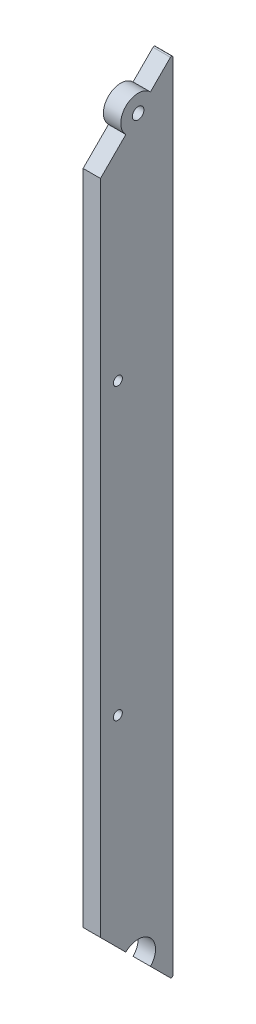
ISO-10303-21;
HEADER;
FILE_DESCRIPTION(('STEP AP214'),'2;1');
FILE_NAME('part.step','',(''),(''),'','','');
FILE_SCHEMA(('AUTOMOTIVE_DESIGN { 1 0 10303 214 1 1 1 1 }'));
ENDSEC;
DATA;
#1=APPLICATION_CONTEXT('core data for automotive mechanical design processes');
#2=APPLICATION_PROTOCOL_DEFINITION('international standard','automotive_design',2000,#1);
#3=PRODUCT_CONTEXT('',#1,'mechanical');
#4=PRODUCT('Part','Part','',(#3));
#5=PRODUCT_RELATED_PRODUCT_CATEGORY('part','',(#4));
#6=PRODUCT_DEFINITION_FORMATION('','',#4);
#7=PRODUCT_DEFINITION_CONTEXT('part definition',#1,'design');
#8=PRODUCT_DEFINITION('design','',#6,#7);
#9=PRODUCT_DEFINITION_SHAPE('','',#8);
#10=(LENGTH_UNIT() NAMED_UNIT(*) SI_UNIT(.MILLI.,.METRE.));
#11=(NAMED_UNIT(*) PLANE_ANGLE_UNIT() SI_UNIT($,.RADIAN.));
#12=(NAMED_UNIT(*) SI_UNIT($,.STERADIAN.) SOLID_ANGLE_UNIT());
#13=UNCERTAINTY_MEASURE_WITH_UNIT(LENGTH_MEASURE(1.E-05),#10,'distance_accuracy_value','');
#14=(GEOMETRIC_REPRESENTATION_CONTEXT(3) GLOBAL_UNCERTAINTY_ASSIGNED_CONTEXT((#13)) GLOBAL_UNIT_ASSIGNED_CONTEXT((#10,
#11,#12)) REPRESENTATION_CONTEXT('',''));
#15=CARTESIAN_POINT('',(0.,0.,0.));
#16=DIRECTION('',(0.,0.,1.));
#17=DIRECTION('',(1.,0.,0.));
#18=AXIS2_PLACEMENT_3D('',#15,#16,#17);
#19=CARTESIAN_POINT('',(6.,30.6749264298105,30.6749264298105));
#20=DIRECTION('',(0.,0.707106781186549,-0.707106781186546));
#21=DIRECTION('',(0.,0.707106781186546,0.707106781186549));
#22=AXIS2_PLACEMENT_3D('',#19,#20,#21);
#23=PLANE('',#22);
#24=DIRECTION('',(0.,-0.707106781186546,-0.707106781186549));
#25=VECTOR('',#24,1.);
#26=CARTESIAN_POINT('',(0.,30.6749264298105,30.6749264298105));
#27=LINE('',#26,#25);
#28=CARTESIAN_POINT('',(0.,30.6749264298105,30.6749264298105));
#29=VERTEX_POINT('',#28);
#30=CARTESIAN_POINT('',(0.,21.9175671169298,21.9175671169298));
#31=VERTEX_POINT('',#30);
#32=EDGE_CURVE('E136',#29,#31,#27,.T.);
#33=ORIENTED_EDGE('',*,*,#32,.T.);
#34=DIRECTION('',(1.,0.,0.));
#35=VECTOR('',#34,1.);
#36=CARTESIAN_POINT('',(0.,21.9175671169298,21.9175671169298));
#37=LINE('',#36,#35);
#38=CARTESIAN_POINT('',(6.,21.9175671169298,21.9175671169298));
#39=VERTEX_POINT('',#38);
#40=EDGE_CURVE('E60',#31,#39,#37,.T.);
#41=ORIENTED_EDGE('',*,*,#40,.T.);
#42=DIRECTION('',(0.,-0.707106781186546,-0.707106781186549));
#43=VECTOR('',#42,1.);
#44=CARTESIAN_POINT('',(6.,30.6749264298105,30.6749264298105));
#45=LINE('',#44,#43);
#46=CARTESIAN_POINT('',(6.,30.6749264298105,30.6749264298105));
#47=VERTEX_POINT('',#46);
#48=EDGE_CURVE('E196',#47,#39,#45,.T.);
#49=ORIENTED_EDGE('',*,*,#48,.F.);
#50=DIRECTION('',(-1.,0.,0.));
#51=VECTOR('',#50,1.);
#52=CARTESIAN_POINT('',(6.,30.6749264298105,30.6749264298105));
#53=LINE('',#52,#51);
#54=EDGE_CURVE('E152',#47,#29,#53,.T.);
#55=ORIENTED_EDGE('',*,*,#54,.T.);
#56=EDGE_LOOP('',(#33,#41,#49,#55));
#57=FACE_BOUND('',#56,.T.);
#58=ADVANCED_FACE('F45',(#57),#23,.F.);
#59=CARTESIAN_POINT('',(6.,257.67492642981,30.6749264298105));
#60=DIRECTION('',(0.,-0.707106781186543,-0.707106781186552));
#61=DIRECTION('',(0.,0.707106781186552,-0.707106781186543));
#62=AXIS2_PLACEMENT_3D('',#59,#60,#61);
#63=PLANE('',#62);
#64=DIRECTION('',(0.,-0.707106781186552,0.707106781186543));
#65=VECTOR('',#64,1.);
#66=CARTESIAN_POINT('',(0.,257.67492642981,30.6749264298105));
#67=LINE('',#66,#65);
#68=CARTESIAN_POINT('',(0.,281.821373039217,6.52847982040379));
#69=VERTEX_POINT('',#68);
#70=CARTESIAN_POINT('',(0.,274.91756711693,13.4322857426912));
#71=VERTEX_POINT('',#70);
#72=EDGE_CURVE('E149',#69,#71,#67,.T.);
#73=ORIENTED_EDGE('',*,*,#72,.T.);
#74=DIRECTION('',(1.,0.,0.));
#75=VECTOR('',#74,1.);
#76=CARTESIAN_POINT('',(-16.9705627484771,274.91756711693,13.4322857426912));
#77=LINE('',#76,#75);
#78=CARTESIAN_POINT('',(6.,274.91756711693,13.4322857426912));
#79=VERTEX_POINT('',#78);
#80=EDGE_CURVE('E140',#71,#79,#77,.T.);
#81=ORIENTED_EDGE('',*,*,#80,.T.);
#82=DIRECTION('',(0.,-0.707106781186552,0.707106781186543));
#83=VECTOR('',#82,1.);
#84=CARTESIAN_POINT('',(6.,257.67492642981,30.6749264298105));
#85=LINE('',#84,#83);
#86=CARTESIAN_POINT('',(6.,281.821373039217,6.52847982040379));
#87=VERTEX_POINT('',#86);
#88=EDGE_CURVE('E183',#87,#79,#85,.T.);
#89=ORIENTED_EDGE('',*,*,#88,.F.);
#90=DIRECTION('',(-1.,0.,0.));
#91=VECTOR('',#90,1.);
#92=CARTESIAN_POINT('',(6.,281.821373039217,6.52847982040379));
#93=LINE('',#92,#91);
#94=EDGE_CURVE('E49',#87,#69,#93,.T.);
#95=ORIENTED_EDGE('',*,*,#94,.T.);
#96=EDGE_LOOP('',(#73,#81,#89,#95));
#97=FACE_BOUND('',#96,.T.);
#98=ADVANCED_FACE('F176',(#97),#63,.F.);
#99=CARTESIAN_POINT('',(6.,13.4322857426912,13.4322857426912));
#100=VERTEX_POINT('',#99);
#101=CARTESIAN_POINT('',(6.,6.5284798204038,6.52847982040374));
#102=VERTEX_POINT('',#101);
#103=EDGE_CURVE('E129',#100,#102,#45,.T.);
#104=ORIENTED_EDGE('',*,*,#103,.F.);
#105=DIRECTION('',(1.,0.,0.));
#106=VECTOR('',#105,1.);
#107=CARTESIAN_POINT('',(0.,13.4322857426912,13.4322857426912));
#108=LINE('',#107,#106);
#109=CARTESIAN_POINT('',(0.,13.4322857426912,13.4322857426912));
#110=VERTEX_POINT('',#109);
#111=EDGE_CURVE('E118',#100,#110,#108,.F.);
#112=ORIENTED_EDGE('',*,*,#111,.T.);
#113=CARTESIAN_POINT('',(0.,6.5284798204038,6.52847982040374));
#114=VERTEX_POINT('',#113);
#115=EDGE_CURVE('E127',#110,#114,#27,.T.);
#116=ORIENTED_EDGE('',*,*,#115,.T.);
#117=DIRECTION('',(-1.,0.,0.));
#118=VECTOR('',#117,1.);
#119=CARTESIAN_POINT('',(6.,6.52847982040379,6.52847982040374));
#120=LINE('',#119,#118);
#121=EDGE_CURVE('E167',#114,#102,#120,.F.);
#122=ORIENTED_EDGE('',*,*,#121,.T.);
#123=EDGE_LOOP('',(#104,#112,#116,#122));
#124=FACE_BOUND('',#123,.T.);
#125=ADVANCED_FACE('F126',(#124),#23,.F.);
#126=CARTESIAN_POINT('',(6.,282.674926429811,5.67492642981051));
#127=DIRECTION('',(0.,0.,1.));
#128=DIRECTION('',(0.,-1.,0.));
#129=AXIS2_PLACEMENT_3D('',#126,#127,#128);
#130=PLANE('',#129);
#131=DIRECTION('',(0.,1.,0.));
#132=VECTOR('',#131,1.);
#133=CARTESIAN_POINT('',(6.,282.674926429811,5.67492642981051));
#134=LINE('',#133,#132);
#135=CARTESIAN_POINT('',(6.,6.88203321099706,5.67492642981048));
#136=VERTEX_POINT('',#135);
#137=CARTESIAN_POINT('',(6.,281.467819648624,5.67492642981051));
#138=VERTEX_POINT('',#137);
#139=EDGE_CURVE('E197',#136,#138,#134,.T.);
#140=ORIENTED_EDGE('',*,*,#139,.F.);
#141=DIRECTION('',(-1.,0.,0.));
#142=VECTOR('',#141,1.);
#143=CARTESIAN_POINT('',(6.,6.88203321099706,5.67492642981048));
#144=LINE('',#143,#142);
#145=CARTESIAN_POINT('',(0.,6.88203321099706,5.67492642981048));
#146=VERTEX_POINT('',#145);
#147=EDGE_CURVE('E161',#136,#146,#144,.T.);
#148=ORIENTED_EDGE('',*,*,#147,.T.);
#149=DIRECTION('',(0.,1.,0.));
#150=VECTOR('',#149,1.);
#151=CARTESIAN_POINT('',(0.,282.674926429811,5.67492642981051));
#152=LINE('',#151,#150);
#153=CARTESIAN_POINT('',(0.,281.467819648624,5.67492642981051));
#154=VERTEX_POINT('',#153);
#155=EDGE_CURVE('E137',#146,#154,#152,.T.);
#156=ORIENTED_EDGE('',*,*,#155,.T.);
#157=DIRECTION('',(-1.,0.,0.));
#158=VECTOR('',#157,1.);
#159=CARTESIAN_POINT('',(6.,281.467819648624,5.67492642981051));
#160=LINE('',#159,#158);
#161=EDGE_CURVE('E158',#154,#138,#160,.F.);
#162=ORIENTED_EDGE('',*,*,#161,.T.);
#163=EDGE_LOOP('',(#140,#148,#156,#162));
#164=FACE_BOUND('',#163,.T.);
#165=ADVANCED_FACE('F264',(#164),#130,.F.);
#166=CARTESIAN_POINT('',(6.,266.432285742691,21.9175671169297));
#167=VERTEX_POINT('',#166);
#168=CARTESIAN_POINT('',(6.,257.67492642981,30.6749264298105));
#169=VERTEX_POINT('',#168);
#170=EDGE_CURVE('E63',#167,#169,#85,.T.);
#171=ORIENTED_EDGE('',*,*,#170,.F.);
#172=DIRECTION('',(1.,0.,0.));
#173=VECTOR('',#172,1.);
#174=CARTESIAN_POINT('',(-16.9705627484771,266.432285742691,21.9175671169297));
#175=LINE('',#174,#173);
#176=CARTESIAN_POINT('',(0.,266.432285742691,21.9175671169297));
#177=VERTEX_POINT('',#176);
#178=EDGE_CURVE('E141',#167,#177,#175,.F.);
#179=ORIENTED_EDGE('',*,*,#178,.T.);
#180=CARTESIAN_POINT('',(0.,257.67492642981,30.6749264298105));
#181=VERTEX_POINT('',#180);
#182=EDGE_CURVE('E147',#177,#181,#67,.T.);
#183=ORIENTED_EDGE('',*,*,#182,.T.);
#184=DIRECTION('',(-1.,0.,0.));
#185=VECTOR('',#184,1.);
#186=CARTESIAN_POINT('',(6.,257.67492642981,30.6749264298105));
#187=LINE('',#186,#185);
#188=EDGE_CURVE('E160',#169,#181,#187,.T.);
#189=ORIENTED_EDGE('',*,*,#188,.F.);
#190=EDGE_LOOP('',(#171,#179,#183,#189));
#191=FACE_BOUND('',#190,.T.);
#192=ADVANCED_FACE('F207',(#191),#63,.F.);
#193=CARTESIAN_POINT('',(6.,30.6749264298105,30.6749264298105));
#194=DIRECTION('',(0.,0.,-1.));
#195=DIRECTION('',(-1.,0.,0.));
#196=AXIS2_PLACEMENT_3D('',#193,#194,#195);
#197=PLANE('',#196);
#198=DIRECTION('',(0.,-1.,0.));
#199=VECTOR('',#198,1.);
#200=CARTESIAN_POINT('',(0.,30.6749264298105,30.6749264298105));
#201=LINE('',#200,#199);
#202=EDGE_CURVE('E155',#181,#29,#201,.T.);
#203=ORIENTED_EDGE('',*,*,#202,.T.);
#204=ORIENTED_EDGE('',*,*,#54,.F.);
#205=DIRECTION('',(0.,-1.,0.));
#206=VECTOR('',#205,1.);
#207=CARTESIAN_POINT('',(6.,30.6749264298105,30.6749264298105));
#208=LINE('',#207,#206);
#209=EDGE_CURVE('E144',#169,#47,#208,.T.);
#210=ORIENTED_EDGE('',*,*,#209,.F.);
#211=ORIENTED_EDGE('',*,*,#188,.T.);
#212=EDGE_LOOP('',(#203,#204,#210,#211));
#213=FACE_BOUND('',#212,.T.);
#214=ADVANCED_FACE('F209',(#213),#197,.F.);
#215=CARTESIAN_POINT('',(6.,0.,0.));
#216=DIRECTION('',(1.,0.,0.));
#217=DIRECTION('',(0.,0.,-1.));
#218=AXIS2_PLACEMENT_3D('',#215,#216,#217);
#219=PLANE('',#218);
#220=CARTESIAN_POINT('',(6.,94.1749264298103,24.6749264298105));
#221=DIRECTION('',(1.,0.,0.));
#222=DIRECTION('',(0.,0.,-1.));
#223=AXIS2_PLACEMENT_3D('',#220,#221,#222);
#224=CIRCLE('',#223,1.55);
#225=CARTESIAN_POINT('',(6.,94.1749264298103,23.1249264298105));
#226=VERTEX_POINT('',#225);
#227=EDGE_CURVE('E217',#226,#226,#224,.T.);
#228=ORIENTED_EDGE('',*,*,#227,.F.);
#229=EDGE_LOOP('',(#228));
#230=FACE_BOUND('',#229,.T.);
#231=CARTESIAN_POINT('',(6.,194.17492642981,24.6749264298105));
#232=DIRECTION('',(1.,0.,0.));
#233=DIRECTION('',(0.,0.,1.));
#234=AXIS2_PLACEMENT_3D('',#231,#232,#233);
#235=CIRCLE('',#234,1.55);
#236=CARTESIAN_POINT('',(6.,194.17492642981,23.1249264298105));
#237=VERTEX_POINT('',#236);
#238=EDGE_CURVE('E223',#237,#237,#235,.T.);
#239=ORIENTED_EDGE('',*,*,#238,.F.);
#240=EDGE_LOOP('',(#239));
#241=FACE_BOUND('',#240,.T.);
#242=CARTESIAN_POINT('',(6.,270.67492642981,17.6749264298102));
#243=DIRECTION('',(1.,0.,0.));
#244=DIRECTION('',(0.,0.,-1.));
#245=AXIS2_PLACEMENT_3D('',#242,#243,#244);
#246=CIRCLE('',#245,2.);
#247=CARTESIAN_POINT('',(6.,270.67492642981,15.6749264298102));
#248=VERTEX_POINT('',#247);
#249=EDGE_CURVE('E211',#248,#248,#246,.T.);
#250=ORIENTED_EDGE('',*,*,#249,.F.);
#251=EDGE_LOOP('',(#250));
#252=FACE_BOUND('',#251,.T.);
#253=CARTESIAN_POINT('',(6.,17.6749264298105,17.6749264298105));
#254=DIRECTION('',(1.,0.,0.));
#255=DIRECTION('',(0.,0.,-1.));
#256=AXIS2_PLACEMENT_3D('',#253,#254,#255);
#257=CIRCLE('',#256,6.);
#258=EDGE_CURVE('E214',#100,#39,#257,.T.);
#259=ORIENTED_EDGE('',*,*,#258,.F.);
#260=ORIENTED_EDGE('',*,*,#103,.T.);
#261=CARTESIAN_POINT('',(6.,6.88203321099706,6.17492642981048));
#262=DIRECTION('',(1.,0.,0.));
#263=DIRECTION('',(0.,0.,-1.));
#264=AXIS2_PLACEMENT_3D('',#261,#262,#263);
#265=CIRCLE('',#264,0.5);
#266=EDGE_CURVE('E175',#102,#136,#265,.T.);
#267=ORIENTED_EDGE('',*,*,#266,.T.);
#268=ORIENTED_EDGE('',*,*,#139,.T.);
#269=CARTESIAN_POINT('',(6.,281.467819648624,6.17492642981051));
#270=DIRECTION('',(1.,0.,0.));
#271=DIRECTION('',(0.,0.,-1.));
#272=AXIS2_PLACEMENT_3D('',#269,#270,#271);
#273=CIRCLE('',#272,0.5);
#274=EDGE_CURVE('E169',#138,#87,#273,.T.);
#275=ORIENTED_EDGE('',*,*,#274,.T.);
#276=ORIENTED_EDGE('',*,*,#88,.T.);
#277=CARTESIAN_POINT('',(6.,270.67492642981,17.6749264298102));
#278=DIRECTION('',(1.,0.,0.));
#279=DIRECTION('',(0.,0.,-1.));
#280=AXIS2_PLACEMENT_3D('',#277,#278,#279);
#281=CIRCLE('',#280,6.);
#282=EDGE_CURVE('E189',#79,#167,#281,.T.);
#283=ORIENTED_EDGE('',*,*,#282,.T.);
#284=ORIENTED_EDGE('',*,*,#170,.T.);
#285=ORIENTED_EDGE('',*,*,#209,.T.);
#286=ORIENTED_EDGE('',*,*,#48,.T.);
#287=EDGE_LOOP('',(#259,#260,#267,#268,#275,#276,#283,#284,#285,#286));
#288=FACE_BOUND('',#287,.T.);
#289=ADVANCED_FACE('F202',(#230,#241,#252,#288),#219,.T.);
#290=CARTESIAN_POINT('',(0.,0.,0.));
#291=DIRECTION('',(1.,0.,0.));
#292=DIRECTION('',(0.,0.,-1.));
#293=AXIS2_PLACEMENT_3D('',#290,#291,#292);
#294=PLANE('',#293);
#295=CARTESIAN_POINT('',(0.,94.1749264298103,24.6749264298105));
#296=DIRECTION('',(1.,0.,0.));
#297=DIRECTION('',(0.,0.,-1.));
#298=AXIS2_PLACEMENT_3D('',#295,#296,#297);
#299=CIRCLE('',#298,1.55);
#300=CARTESIAN_POINT('',(0.,94.1749264298103,23.1249264298105));
#301=VERTEX_POINT('',#300);
#302=EDGE_CURVE('E215',#301,#301,#299,.F.);
#303=ORIENTED_EDGE('',*,*,#302,.F.);
#304=EDGE_LOOP('',(#303));
#305=FACE_BOUND('',#304,.T.);
#306=CARTESIAN_POINT('',(0.,194.17492642981,24.6749264298105));
#307=DIRECTION('',(1.,0.,0.));
#308=DIRECTION('',(0.,0.,-1.));
#309=AXIS2_PLACEMENT_3D('',#306,#307,#308);
#310=CIRCLE('',#309,1.55);
#311=CARTESIAN_POINT('',(0.,194.17492642981,23.1249264298105));
#312=VERTEX_POINT('',#311);
#313=EDGE_CURVE('E228',#312,#312,#310,.F.);
#314=ORIENTED_EDGE('',*,*,#313,.F.);
#315=EDGE_LOOP('',(#314));
#316=FACE_BOUND('',#315,.T.);
#317=CARTESIAN_POINT('',(0.,270.67492642981,17.6749264298102));
#318=DIRECTION('',(1.,0.,0.));
#319=DIRECTION('',(0.,0.,-1.));
#320=AXIS2_PLACEMENT_3D('',#317,#318,#319);
#321=CIRCLE('',#320,2.);
#322=CARTESIAN_POINT('',(0.,270.67492642981,15.6749264298102));
#323=VERTEX_POINT('',#322);
#324=EDGE_CURVE('E132',#323,#323,#321,.T.);
#325=ORIENTED_EDGE('',*,*,#324,.T.);
#326=EDGE_LOOP('',(#325));
#327=FACE_BOUND('',#326,.T.);
#328=ORIENTED_EDGE('',*,*,#115,.F.);
#329=CARTESIAN_POINT('',(0.,17.6749264298105,17.6749264298105));
#330=DIRECTION('',(1.,0.,0.));
#331=DIRECTION('',(0.,0.,-1.));
#332=AXIS2_PLACEMENT_3D('',#329,#330,#331);
#333=CIRCLE('',#332,6.);
#334=EDGE_CURVE('E12',#110,#31,#333,.T.);
#335=ORIENTED_EDGE('',*,*,#334,.T.);
#336=ORIENTED_EDGE('',*,*,#32,.F.);
#337=ORIENTED_EDGE('',*,*,#202,.F.);
#338=ORIENTED_EDGE('',*,*,#182,.F.);
#339=CARTESIAN_POINT('',(0.,270.67492642981,17.6749264298102));
#340=DIRECTION('',(1.,0.,0.));
#341=DIRECTION('',(0.,0.,-1.));
#342=AXIS2_PLACEMENT_3D('',#339,#340,#341);
#343=CIRCLE('',#342,6.);
#344=EDGE_CURVE('E188',#177,#71,#343,.F.);
#345=ORIENTED_EDGE('',*,*,#344,.T.);
#346=ORIENTED_EDGE('',*,*,#72,.F.);
#347=CARTESIAN_POINT('',(0.,281.467819648624,6.17492642981051));
#348=DIRECTION('',(1.,0.,0.));
#349=DIRECTION('',(0.,0.,-1.));
#350=AXIS2_PLACEMENT_3D('',#347,#348,#349);
#351=CIRCLE('',#350,0.5);
#352=EDGE_CURVE('E162',#69,#154,#351,.F.);
#353=ORIENTED_EDGE('',*,*,#352,.T.);
#354=ORIENTED_EDGE('',*,*,#155,.F.);
#355=CARTESIAN_POINT('',(0.,6.88203321099706,6.17492642981048));
#356=DIRECTION('',(1.,0.,0.));
#357=DIRECTION('',(0.,0.,-1.));
#358=AXIS2_PLACEMENT_3D('',#355,#356,#357);
#359=CIRCLE('',#358,0.5);
#360=EDGE_CURVE('E133',#146,#114,#359,.F.);
#361=ORIENTED_EDGE('',*,*,#360,.T.);
#362=EDGE_LOOP('',(#328,#335,#336,#337,#338,#345,#346,#353,#354,#361));
#363=FACE_BOUND('',#362,.T.);
#364=ADVANCED_FACE('F134',(#305,#316,#327,#363),#294,.F.);
#365=CARTESIAN_POINT('',(6.,6.88203321099706,6.17492642981048));
#366=DIRECTION('',(-1.,0.,0.));
#367=DIRECTION('',(0.,0.,1.));
#368=AXIS2_PLACEMENT_3D('',#365,#366,#367);
#369=CYLINDRICAL_SURFACE('',#368,0.5);
#370=ORIENTED_EDGE('',*,*,#266,.F.);
#371=ORIENTED_EDGE('',*,*,#121,.F.);
#372=ORIENTED_EDGE('',*,*,#360,.F.);
#373=ORIENTED_EDGE('',*,*,#147,.F.);
#374=EDGE_LOOP('',(#370,#371,#372,#373));
#375=FACE_BOUND('',#374,.T.);
#376=ADVANCED_FACE('F280',(#375),#369,.T.);
#377=CARTESIAN_POINT('',(6.,281.467819648624,6.17492642981051));
#378=DIRECTION('',(-1.,0.,0.));
#379=DIRECTION('',(0.,0.,1.));
#380=AXIS2_PLACEMENT_3D('',#377,#378,#379);
#381=CYLINDRICAL_SURFACE('',#380,0.5);
#382=ORIENTED_EDGE('',*,*,#274,.F.);
#383=ORIENTED_EDGE('',*,*,#161,.F.);
#384=ORIENTED_EDGE('',*,*,#352,.F.);
#385=ORIENTED_EDGE('',*,*,#94,.F.);
#386=EDGE_LOOP('',(#382,#383,#384,#385));
#387=FACE_BOUND('',#386,.T.);
#388=ADVANCED_FACE('F42',(#387),#381,.T.);
#389=CARTESIAN_POINT('',(-16.9705627484771,270.67492642981,17.6749264298102));
#390=DIRECTION('',(1.,0.,0.));
#391=DIRECTION('',(0.,0.,-1.));
#392=AXIS2_PLACEMENT_3D('',#389,#390,#391);
#393=CYLINDRICAL_SURFACE('',#392,6.);
#394=ORIENTED_EDGE('',*,*,#80,.F.);
#395=ORIENTED_EDGE('',*,*,#344,.F.);
#396=ORIENTED_EDGE('',*,*,#178,.F.);
#397=ORIENTED_EDGE('',*,*,#282,.F.);
#398=EDGE_LOOP('',(#394,#395,#396,#397));
#399=FACE_BOUND('',#398,.T.);
#400=ADVANCED_FACE('F251',(#399),#393,.T.);
#401=CARTESIAN_POINT('',(0.,17.6749264298105,17.6749264298105));
#402=DIRECTION('',(1.,0.,0.));
#403=DIRECTION('',(0.,0.,-1.));
#404=AXIS2_PLACEMENT_3D('',#401,#402,#403);
#405=CYLINDRICAL_SURFACE('',#404,6.);
#406=ORIENTED_EDGE('',*,*,#334,.F.);
#407=ORIENTED_EDGE('',*,*,#111,.F.);
#408=ORIENTED_EDGE('',*,*,#258,.T.);
#409=ORIENTED_EDGE('',*,*,#40,.F.);
#410=EDGE_LOOP('',(#406,#407,#408,#409));
#411=FACE_BOUND('',#410,.T.);
#412=ADVANCED_FACE('F120',(#411),#405,.F.);
#413=CARTESIAN_POINT('',(0.,270.67492642981,17.6749264298102));
#414=DIRECTION('',(1.,0.,0.));
#415=DIRECTION('',(0.,0.,-1.));
#416=AXIS2_PLACEMENT_3D('',#413,#414,#415);
#417=CYLINDRICAL_SURFACE('',#416,2.);
#418=ORIENTED_EDGE('',*,*,#324,.F.);
#419=EDGE_LOOP('',(#418));
#420=FACE_BOUND('',#419,.T.);
#421=ORIENTED_EDGE('',*,*,#249,.T.);
#422=EDGE_LOOP('',(#421));
#423=FACE_BOUND('',#422,.T.);
#424=ADVANCED_FACE('F245',(#420,#423),#417,.F.);
#425=CARTESIAN_POINT('',(-0.00100000000000013,194.17492642981,24.6749264298105));
#426=DIRECTION('',(1.,0.,0.));
#427=DIRECTION('',(0.,0.,-1.));
#428=AXIS2_PLACEMENT_3D('',#425,#426,#427);
#429=CYLINDRICAL_SURFACE('',#428,1.55);
#430=CARTESIAN_POINT('',(6.,194.17492642981,23.1249264298105));
#431=CARTESIAN_POINT('',(5.9375,194.17492642981,23.1249264298105));
#432=CARTESIAN_POINT('',(5.875,194.17492642981,23.1249264298105));
#433=CARTESIAN_POINT('',(5.75,194.17492642981,23.1249264298105));
#434=CARTESIAN_POINT('',(5.6875,194.17492642981,23.1249264298105));
#435=CARTESIAN_POINT('',(5.5625,194.17492642981,23.1249264298105));
#436=CARTESIAN_POINT('',(5.5,194.17492642981,23.1249264298105));
#437=CARTESIAN_POINT('',(5.375,194.17492642981,23.1249264298105));
#438=CARTESIAN_POINT('',(5.3125,194.17492642981,23.1249264298105));
#439=CARTESIAN_POINT('',(5.1875,194.17492642981,23.1249264298105));
#440=CARTESIAN_POINT('',(5.125,194.17492642981,23.1249264298105));
#441=CARTESIAN_POINT('',(5.,194.17492642981,23.1249264298105));
#442=CARTESIAN_POINT('',(4.9375,194.17492642981,23.1249264298105));
#443=CARTESIAN_POINT('',(4.8125,194.17492642981,23.1249264298105));
#444=CARTESIAN_POINT('',(4.75,194.17492642981,23.1249264298105));
#445=CARTESIAN_POINT('',(4.625,194.17492642981,23.1249264298105));
#446=CARTESIAN_POINT('',(4.5625,194.17492642981,23.1249264298105));
#447=CARTESIAN_POINT('',(4.4375,194.17492642981,23.1249264298105));
#448=CARTESIAN_POINT('',(4.375,194.17492642981,23.1249264298105));
#449=CARTESIAN_POINT('',(4.25,194.17492642981,23.1249264298105));
#450=CARTESIAN_POINT('',(4.1875,194.17492642981,23.1249264298105));
#451=CARTESIAN_POINT('',(4.0625,194.17492642981,23.1249264298105));
#452=CARTESIAN_POINT('',(4.,194.17492642981,23.1249264298105));
#453=CARTESIAN_POINT('',(3.875,194.17492642981,23.1249264298105));
#454=CARTESIAN_POINT('',(3.8125,194.17492642981,23.1249264298105));
#455=CARTESIAN_POINT('',(3.6875,194.17492642981,23.1249264298105));
#456=CARTESIAN_POINT('',(3.625,194.17492642981,23.1249264298105));
#457=CARTESIAN_POINT('',(3.5,194.17492642981,23.1249264298105));
#458=CARTESIAN_POINT('',(3.4375,194.17492642981,23.1249264298105));
#459=CARTESIAN_POINT('',(3.3125,194.17492642981,23.1249264298105));
#460=CARTESIAN_POINT('',(3.25,194.17492642981,23.1249264298105));
#461=CARTESIAN_POINT('',(3.125,194.17492642981,23.1249264298105));
#462=CARTESIAN_POINT('',(3.0625,194.17492642981,23.1249264298105));
#463=CARTESIAN_POINT('',(2.9375,194.17492642981,23.1249264298105));
#464=CARTESIAN_POINT('',(2.875,194.17492642981,23.1249264298105));
#465=CARTESIAN_POINT('',(2.75,194.17492642981,23.1249264298105));
#466=CARTESIAN_POINT('',(2.6875,194.17492642981,23.1249264298105));
#467=CARTESIAN_POINT('',(2.5625,194.17492642981,23.1249264298105));
#468=CARTESIAN_POINT('',(2.5,194.17492642981,23.1249264298105));
#469=CARTESIAN_POINT('',(2.375,194.17492642981,23.1249264298105));
#470=CARTESIAN_POINT('',(2.3125,194.17492642981,23.1249264298105));
#471=CARTESIAN_POINT('',(2.1875,194.17492642981,23.1249264298105));
#472=CARTESIAN_POINT('',(2.125,194.17492642981,23.1249264298105));
#473=CARTESIAN_POINT('',(2.,194.17492642981,23.1249264298105));
#474=CARTESIAN_POINT('',(1.9375,194.17492642981,23.1249264298105));
#475=CARTESIAN_POINT('',(1.8125,194.17492642981,23.1249264298105));
#476=CARTESIAN_POINT('',(1.75,194.17492642981,23.1249264298105));
#477=CARTESIAN_POINT('',(1.625,194.17492642981,23.1249264298105));
#478=CARTESIAN_POINT('',(1.5625,194.17492642981,23.1249264298105));
#479=CARTESIAN_POINT('',(1.4375,194.17492642981,23.1249264298105));
#480=CARTESIAN_POINT('',(1.375,194.17492642981,23.1249264298105));
#481=CARTESIAN_POINT('',(1.25,194.17492642981,23.1249264298105));
#482=CARTESIAN_POINT('',(1.1875,194.17492642981,23.1249264298105));
#483=CARTESIAN_POINT('',(1.0625,194.17492642981,23.1249264298105));
#484=CARTESIAN_POINT('',(1.,194.17492642981,23.1249264298105));
#485=CARTESIAN_POINT('',(0.875,194.17492642981,23.1249264298105));
#486=CARTESIAN_POINT('',(0.8125,194.17492642981,23.1249264298105));
#487=CARTESIAN_POINT('',(0.6875,194.17492642981,23.1249264298105));
#488=CARTESIAN_POINT('',(0.625,194.17492642981,23.1249264298105));
#489=CARTESIAN_POINT('',(0.5,194.17492642981,23.1249264298105));
#490=CARTESIAN_POINT('',(0.4375,194.17492642981,23.1249264298105));
#491=CARTESIAN_POINT('',(0.3125,194.17492642981,23.1249264298105));
#492=CARTESIAN_POINT('',(0.25,194.17492642981,23.1249264298105));
#493=CARTESIAN_POINT('',(0.125,194.17492642981,23.1249264298105));
#494=CARTESIAN_POINT('',(0.0625000000000001,194.17492642981,23.1249264298105));
#495=CARTESIAN_POINT('',(0.,194.17492642981,23.1249264298105));
#496=B_SPLINE_CURVE_WITH_KNOTS('',3,(#430,#431,#432,#433,#434,#435,#436,#437,#438,#439,#440,
#441,#442,#443,#444,#445,#446,#447,#448,#449,#450,#451,#452,#453,#454,#455,#456,#457,#458,#459,
#460,#461,#462,#463,#464,#465,#466,#467,#468,#469,#470,#471,#472,#473,#474,#475,#476,#477,#478,
#479,#480,#481,#482,#483,#484,#485,#486,#487,#488,#489,#490,#491,#492,#493,#494,#495),
.UNSPECIFIED.,.F.,.F.,(4,2,2,2,2,2,2,2,2,2,2,2,2,2,2,2,2,2,2,2,2,2,2,2,2,2,2,2,2,2,2,2,4),(0.,
0.1875,0.375,0.5625,0.75,0.9375,1.125,1.3125,1.5,1.6875,1.875,2.0625,2.25,2.4375,2.625,2.8125,
3.,3.1875,3.375,3.5625,3.75,3.9375,4.125,4.3125,4.5,4.6875,4.875,5.0625,5.25,5.4375,5.625,
5.8125,6.),.UNSPECIFIED.);
#497=EDGE_CURVE('BSEAM243',#237,#312,#496,.T.);
#498=ORIENTED_EDGE('',*,*,#238,.T.);
#499=ORIENTED_EDGE('',*,*,#313,.T.);
#500=ORIENTED_EDGE('',*,*,#497,.T.);
#501=ORIENTED_EDGE('',*,*,#497,.F.);
#502=EDGE_LOOP('',(#498,#500,#499,#501));
#503=FACE_BOUND('',#502,.T.);
#504=ADVANCED_FACE('F243',(#503),#429,.F.);
#505=CARTESIAN_POINT('',(-0.00100000000000013,94.1749264298103,24.6749264298105));
#506=DIRECTION('',(1.,0.,0.));
#507=DIRECTION('',(0.,0.,-1.));
#508=AXIS2_PLACEMENT_3D('',#505,#506,#507);
#509=CYLINDRICAL_SURFACE('',#508,1.55);
#510=CARTESIAN_POINT('',(6.,94.1749264298103,23.1249264298105));
#511=CARTESIAN_POINT('',(5.9375,94.1749264298103,23.1249264298105));
#512=CARTESIAN_POINT('',(5.875,94.1749264298103,23.1249264298105));
#513=CARTESIAN_POINT('',(5.75,94.1749264298103,23.1249264298105));
#514=CARTESIAN_POINT('',(5.6875,94.1749264298103,23.1249264298105));
#515=CARTESIAN_POINT('',(5.5625,94.1749264298103,23.1249264298105));
#516=CARTESIAN_POINT('',(5.5,94.1749264298103,23.1249264298105));
#517=CARTESIAN_POINT('',(5.375,94.1749264298103,23.1249264298105));
#518=CARTESIAN_POINT('',(5.3125,94.1749264298103,23.1249264298105));
#519=CARTESIAN_POINT('',(5.1875,94.1749264298103,23.1249264298105));
#520=CARTESIAN_POINT('',(5.125,94.1749264298103,23.1249264298105));
#521=CARTESIAN_POINT('',(5.,94.1749264298103,23.1249264298105));
#522=CARTESIAN_POINT('',(4.9375,94.1749264298103,23.1249264298105));
#523=CARTESIAN_POINT('',(4.8125,94.1749264298103,23.1249264298105));
#524=CARTESIAN_POINT('',(4.75,94.1749264298103,23.1249264298105));
#525=CARTESIAN_POINT('',(4.625,94.1749264298103,23.1249264298105));
#526=CARTESIAN_POINT('',(4.5625,94.1749264298103,23.1249264298105));
#527=CARTESIAN_POINT('',(4.4375,94.1749264298103,23.1249264298105));
#528=CARTESIAN_POINT('',(4.375,94.1749264298103,23.1249264298105));
#529=CARTESIAN_POINT('',(4.25,94.1749264298103,23.1249264298105));
#530=CARTESIAN_POINT('',(4.1875,94.1749264298103,23.1249264298105));
#531=CARTESIAN_POINT('',(4.0625,94.1749264298103,23.1249264298105));
#532=CARTESIAN_POINT('',(4.,94.1749264298103,23.1249264298105));
#533=CARTESIAN_POINT('',(3.875,94.1749264298103,23.1249264298105));
#534=CARTESIAN_POINT('',(3.8125,94.1749264298103,23.1249264298105));
#535=CARTESIAN_POINT('',(3.6875,94.1749264298103,23.1249264298105));
#536=CARTESIAN_POINT('',(3.625,94.1749264298103,23.1249264298105));
#537=CARTESIAN_POINT('',(3.5,94.1749264298103,23.1249264298105));
#538=CARTESIAN_POINT('',(3.4375,94.1749264298103,23.1249264298105));
#539=CARTESIAN_POINT('',(3.3125,94.1749264298103,23.1249264298105));
#540=CARTESIAN_POINT('',(3.25,94.1749264298103,23.1249264298105));
#541=CARTESIAN_POINT('',(3.125,94.1749264298103,23.1249264298105));
#542=CARTESIAN_POINT('',(3.0625,94.1749264298103,23.1249264298105));
#543=CARTESIAN_POINT('',(2.9375,94.1749264298103,23.1249264298105));
#544=CARTESIAN_POINT('',(2.875,94.1749264298103,23.1249264298105));
#545=CARTESIAN_POINT('',(2.75,94.1749264298103,23.1249264298105));
#546=CARTESIAN_POINT('',(2.6875,94.1749264298103,23.1249264298105));
#547=CARTESIAN_POINT('',(2.5625,94.1749264298103,23.1249264298105));
#548=CARTESIAN_POINT('',(2.5,94.1749264298103,23.1249264298105));
#549=CARTESIAN_POINT('',(2.375,94.1749264298103,23.1249264298105));
#550=CARTESIAN_POINT('',(2.3125,94.1749264298103,23.1249264298105));
#551=CARTESIAN_POINT('',(2.1875,94.1749264298103,23.1249264298105));
#552=CARTESIAN_POINT('',(2.125,94.1749264298103,23.1249264298105));
#553=CARTESIAN_POINT('',(2.,94.1749264298103,23.1249264298105));
#554=CARTESIAN_POINT('',(1.9375,94.1749264298103,23.1249264298105));
#555=CARTESIAN_POINT('',(1.8125,94.1749264298103,23.1249264298105));
#556=CARTESIAN_POINT('',(1.75,94.1749264298103,23.1249264298105));
#557=CARTESIAN_POINT('',(1.625,94.1749264298103,23.1249264298105));
#558=CARTESIAN_POINT('',(1.5625,94.1749264298103,23.1249264298105));
#559=CARTESIAN_POINT('',(1.4375,94.1749264298103,23.1249264298105));
#560=CARTESIAN_POINT('',(1.375,94.1749264298103,23.1249264298105));
#561=CARTESIAN_POINT('',(1.25,94.1749264298103,23.1249264298105));
#562=CARTESIAN_POINT('',(1.1875,94.1749264298103,23.1249264298105));
#563=CARTESIAN_POINT('',(1.0625,94.1749264298103,23.1249264298105));
#564=CARTESIAN_POINT('',(1.,94.1749264298103,23.1249264298105));
#565=CARTESIAN_POINT('',(0.875,94.1749264298103,23.1249264298105));
#566=CARTESIAN_POINT('',(0.8125,94.1749264298103,23.1249264298105));
#567=CARTESIAN_POINT('',(0.6875,94.1749264298103,23.1249264298105));
#568=CARTESIAN_POINT('',(0.625,94.1749264298103,23.1249264298105));
#569=CARTESIAN_POINT('',(0.5,94.1749264298103,23.1249264298105));
#570=CARTESIAN_POINT('',(0.4375,94.1749264298103,23.1249264298105));
#571=CARTESIAN_POINT('',(0.3125,94.1749264298103,23.1249264298105));
#572=CARTESIAN_POINT('',(0.25,94.1749264298103,23.1249264298105));
#573=CARTESIAN_POINT('',(0.125,94.1749264298103,23.1249264298105));
#574=CARTESIAN_POINT('',(0.0625000000000001,94.1749264298103,23.1249264298105));
#575=CARTESIAN_POINT('',(0.,94.1749264298103,23.1249264298105));
#576=B_SPLINE_CURVE_WITH_KNOTS('',3,(#510,#511,#512,#513,#514,#515,#516,#517,#518,#519,#520,
#521,#522,#523,#524,#525,#526,#527,#528,#529,#530,#531,#532,#533,#534,#535,#536,#537,#538,#539,
#540,#541,#542,#543,#544,#545,#546,#547,#548,#549,#550,#551,#552,#553,#554,#555,#556,#557,#558,
#559,#560,#561,#562,#563,#564,#565,#566,#567,#568,#569,#570,#571,#572,#573,#574,#575),
.UNSPECIFIED.,.F.,.F.,(4,2,2,2,2,2,2,2,2,2,2,2,2,2,2,2,2,2,2,2,2,2,2,2,2,2,2,2,2,2,2,2,4),(0.,
0.1875,0.375,0.5625,0.75,0.9375,1.125,1.3125,1.5,1.6875,1.875,2.0625,2.25,2.4375,2.625,2.8125,
3.,3.1875,3.375,3.5625,3.75,3.9375,4.125,4.3125,4.5,4.6875,4.875,5.0625,5.25,5.4375,5.625,
5.8125,6.),.UNSPECIFIED.);
#577=EDGE_CURVE('BSEAM235',#226,#301,#576,.T.);
#578=ORIENTED_EDGE('',*,*,#227,.T.);
#579=ORIENTED_EDGE('',*,*,#302,.T.);
#580=ORIENTED_EDGE('',*,*,#577,.T.);
#581=ORIENTED_EDGE('',*,*,#577,.F.);
#582=EDGE_LOOP('',(#578,#580,#579,#581));
#583=FACE_BOUND('',#582,.T.);
#584=ADVANCED_FACE('F235',(#583),#509,.F.);
#585=CLOSED_SHELL('',(#58,#98,#125,#165,#192,#214,#289,#364,#376,#388,#400,#412,#424,#504,#584));
#586=MANIFOLD_SOLID_BREP('B2',#585);
#587=ADVANCED_BREP_SHAPE_REPRESENTATION('',(#18,#586),#14);
#588=SHAPE_DEFINITION_REPRESENTATION(#9,#587);
ENDSEC;
END-ISO-10303-21;
